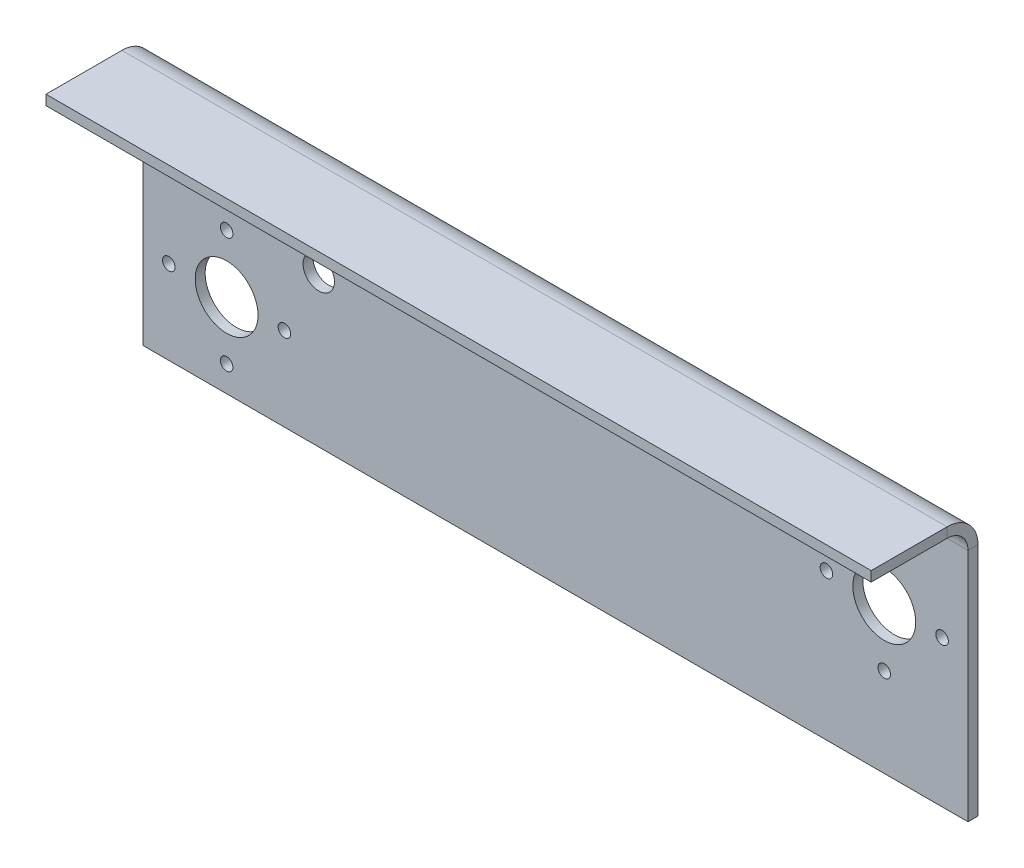
ISO-10303-21;
HEADER;
FILE_DESCRIPTION(('STEP AP214'),'2;1');
FILE_NAME('part.step','',(''),(''),'','','');
FILE_SCHEMA(('AUTOMOTIVE_DESIGN { 1 0 10303 214 1 1 1 1 }'));
ENDSEC;
DATA;
#1=APPLICATION_CONTEXT('core data for automotive mechanical design processes');
#2=APPLICATION_PROTOCOL_DEFINITION('international standard','automotive_design',2000,#1);
#3=PRODUCT_CONTEXT('',#1,'mechanical');
#4=PRODUCT('Part','Part','',(#3));
#5=PRODUCT_RELATED_PRODUCT_CATEGORY('part','',(#4));
#6=PRODUCT_DEFINITION_FORMATION('','',#4);
#7=PRODUCT_DEFINITION_CONTEXT('part definition',#1,'design');
#8=PRODUCT_DEFINITION('design','',#6,#7);
#9=PRODUCT_DEFINITION_SHAPE('','',#8);
#10=(LENGTH_UNIT() NAMED_UNIT(*) SI_UNIT(.MILLI.,.METRE.));
#11=(NAMED_UNIT(*) PLANE_ANGLE_UNIT() SI_UNIT($,.RADIAN.));
#12=(NAMED_UNIT(*) SI_UNIT($,.STERADIAN.) SOLID_ANGLE_UNIT());
#13=UNCERTAINTY_MEASURE_WITH_UNIT(LENGTH_MEASURE(1.E-05),#10,'distance_accuracy_value','');
#14=(GEOMETRIC_REPRESENTATION_CONTEXT(3) GLOBAL_UNCERTAINTY_ASSIGNED_CONTEXT((#13)) GLOBAL_UNIT_ASSIGNED_CONTEXT((#10,
#11,#12)) REPRESENTATION_CONTEXT('',''));
#15=CARTESIAN_POINT('',(0.,0.,0.));
#16=DIRECTION('',(0.,0.,1.));
#17=DIRECTION('',(1.,0.,0.));
#18=AXIS2_PLACEMENT_3D('',#15,#16,#17);
#19=CARTESIAN_POINT('',(-40.,87.,4.7625));
#20=DIRECTION('',(-1.,0.,0.));
#21=DIRECTION('',(0.,-1.,0.));
#22=AXIS2_PLACEMENT_3D('',#19,#20,#21);
#23=PLANE('',#22);
#24=DIRECTION('',(0.,-1.,0.));
#25=VECTOR('',#24,1.);
#26=CARTESIAN_POINT('',(-40.,87.,4.7625));
#27=LINE('',#26,#25);
#28=CARTESIAN_POINT('',(-40.,72.2375,4.7625));
#29=VERTEX_POINT('',#28);
#30=CARTESIAN_POINT('',(-40.,-40.,4.7625));
#31=VERTEX_POINT('',#30);
#32=EDGE_CURVE('E265',#29,#31,#27,.T.);
#33=ORIENTED_EDGE('',*,*,#32,.F.);
#34=DIRECTION('',(0.,0.,-1.));
#35=VECTOR('',#34,1.);
#36=CARTESIAN_POINT('',(-40.,72.2375,4.7625));
#37=LINE('',#36,#35);
#38=CARTESIAN_POINT('',(-40.,72.2375,0.));
#39=VERTEX_POINT('',#38);
#40=EDGE_CURVE('E221',#29,#39,#37,.T.);
#41=ORIENTED_EDGE('',*,*,#40,.T.);
#42=DIRECTION('',(0.,1.,0.));
#43=VECTOR('',#42,1.);
#44=CARTESIAN_POINT('',(-40.,0.,0.));
#45=LINE('',#44,#43);
#46=CARTESIAN_POINT('',(-40.,-40.,0.));
#47=VERTEX_POINT('',#46);
#48=EDGE_CURVE('E302',#39,#47,#45,.F.);
#49=ORIENTED_EDGE('',*,*,#48,.T.);
#50=DIRECTION('',(0.,0.,1.));
#51=VECTOR('',#50,1.);
#52=CARTESIAN_POINT('',(-40.,-40.,4.7625));
#53=LINE('',#52,#51);
#54=EDGE_CURVE('E65',#47,#31,#53,.T.);
#55=ORIENTED_EDGE('',*,*,#54,.T.);
#56=EDGE_LOOP('',(#33,#41,#49,#55));
#57=FACE_BOUND('',#56,.T.);
#58=ADVANCED_FACE('F61',(#57),#23,.T.);
#59=CARTESIAN_POINT('',(0.,0.,4.7625));
#60=DIRECTION('',(0.,0.,1.));
#61=DIRECTION('',(1.,0.,0.));
#62=AXIS2_PLACEMENT_3D('',#59,#60,#61);
#63=PLANE('',#62);
#64=CARTESIAN_POINT('',(276.,64.,4.7625));
#65=DIRECTION('',(0.,0.,1.));
#66=DIRECTION('',(1.,0.,0.));
#67=AXIS2_PLACEMENT_3D('',#64,#65,#66);
#68=CIRCLE('',#67,7.99999999999999);
#69=CARTESIAN_POINT('',(284.,64.,4.7625));
#70=VERTEX_POINT('',#69);
#71=EDGE_CURVE('E652',#70,#70,#68,.T.);
#72=ORIENTED_EDGE('',*,*,#71,.F.);
#73=EDGE_LOOP('',(#72));
#74=FACE_BOUND('',#73,.T.);
#75=CARTESIAN_POINT('',(44.,32.,4.7625));
#76=DIRECTION('',(0.,0.,1.));
#77=DIRECTION('',(1.,0.,0.));
#78=AXIS2_PLACEMENT_3D('',#75,#76,#77);
#79=CIRCLE('',#78,7.50000000000001);
#80=CARTESIAN_POINT('',(51.5,32.,4.7625));
#81=VERTEX_POINT('',#80);
#82=EDGE_CURVE('E662',#81,#81,#79,.T.);
#83=ORIENTED_EDGE('',*,*,#82,.F.);
#84=EDGE_LOOP('',(#83));
#85=FACE_BOUND('',#84,.T.);
#86=CARTESIAN_POINT('',(7.00000000000001,64.,4.7625));
#87=DIRECTION('',(0.,0.,1.));
#88=DIRECTION('',(1.,0.,0.));
#89=AXIS2_PLACEMENT_3D('',#86,#87,#88);
#90=CIRCLE('',#89,4.99999999999999);
#91=CARTESIAN_POINT('',(7.00000000000001,69.,4.7625));
#92=VERTEX_POINT('',#91);
#93=CARTESIAN_POINT('',(7.00000000000001,59.,4.7625));
#94=VERTEX_POINT('',#93);
#95=EDGE_CURVE('E182',#92,#94,#90,.T.);
#96=ORIENTED_EDGE('',*,*,#95,.F.);
#97=DIRECTION('',(-1.,0.,0.));
#98=VECTOR('',#97,1.);
#99=CARTESIAN_POINT('',(0.,69.,4.7625));
#100=LINE('',#99,#98);
#101=CARTESIAN_POINT('',(161.,69.,4.7625));
#102=VERTEX_POINT('',#101);
#103=EDGE_CURVE('E175',#102,#92,#100,.T.);
#104=ORIENTED_EDGE('',*,*,#103,.F.);
#105=CARTESIAN_POINT('',(161.,64.,4.7625));
#106=DIRECTION('',(0.,0.,1.));
#107=DIRECTION('',(1.,0.,0.));
#108=AXIS2_PLACEMENT_3D('',#105,#106,#107);
#109=CIRCLE('',#108,5.);
#110=CARTESIAN_POINT('',(161.,59.,4.7625));
#111=VERTEX_POINT('',#110);
#112=EDGE_CURVE('E155',#111,#102,#109,.T.);
#113=ORIENTED_EDGE('',*,*,#112,.F.);
#114=DIRECTION('',(1.,0.,0.));
#115=VECTOR('',#114,1.);
#116=CARTESIAN_POINT('',(0.,59.,4.7625));
#117=LINE('',#116,#115);
#118=EDGE_CURVE('E180',#94,#111,#117,.T.);
#119=ORIENTED_EDGE('',*,*,#118,.F.);
#120=EDGE_LOOP('',(#96,#104,#113,#119));
#121=FACE_BOUND('',#120,.T.);
#122=CARTESIAN_POINT('',(286.4,29.9999999999999,4.7625));
#123=DIRECTION('',(0.,0.,1.));
#124=DIRECTION('',(0.,1.,0.));
#125=AXIS2_PLACEMENT_3D('',#122,#123,#124);
#126=CIRCLE('',#125,2.99999999999999);
#127=CARTESIAN_POINT('',(286.4,32.9999999999999,4.7625));
#128=VERTEX_POINT('',#127);
#129=EDGE_CURVE('E237',#128,#128,#126,.T.);
#130=ORIENTED_EDGE('',*,*,#129,.F.);
#131=EDGE_LOOP('',(#130));
#132=FACE_BOUND('',#131,.T.);
#133=CARTESIAN_POINT('',(314.,2.4,4.7625));
#134=DIRECTION('',(0.,0.,1.));
#135=DIRECTION('',(-1.,0.,0.));
#136=AXIS2_PLACEMENT_3D('',#133,#134,#135);
#137=CIRCLE('',#136,2.99999999999999);
#138=CARTESIAN_POINT('',(311.,2.4,4.7625));
#139=VERTEX_POINT('',#138);
#140=EDGE_CURVE('E240',#139,#139,#137,.T.);
#141=ORIENTED_EDGE('',*,*,#140,.F.);
#142=EDGE_LOOP('',(#141));
#143=FACE_BOUND('',#142,.T.);
#144=CARTESIAN_POINT('',(341.6,30.0000000000002,4.7625));
#145=DIRECTION('',(0.,0.,1.));
#146=DIRECTION('',(0.,-1.,0.));
#147=AXIS2_PLACEMENT_3D('',#144,#145,#146);
#148=CIRCLE('',#147,2.99999999999999);
#149=CARTESIAN_POINT('',(341.6,27.0000000000003,4.7625));
#150=VERTEX_POINT('',#149);
#151=EDGE_CURVE('E244',#150,#150,#148,.T.);
#152=ORIENTED_EDGE('',*,*,#151,.F.);
#153=EDGE_LOOP('',(#152));
#154=FACE_BOUND('',#153,.T.);
#155=CARTESIAN_POINT('',(314.,57.6,4.7625));
#156=DIRECTION('',(0.,0.,1.));
#157=DIRECTION('',(1.,0.,0.));
#158=AXIS2_PLACEMENT_3D('',#155,#156,#157);
#159=CIRCLE('',#158,2.99999999999999);
#160=CARTESIAN_POINT('',(317.,57.6,4.7625));
#161=VERTEX_POINT('',#160);
#162=EDGE_CURVE('E247',#161,#161,#159,.T.);
#163=ORIENTED_EDGE('',*,*,#162,.F.);
#164=EDGE_LOOP('',(#163));
#165=FACE_BOUND('',#164,.T.);
#166=CARTESIAN_POINT('',(-27.5975865890763,-3.92185310250527E-12,4.7625));
#167=DIRECTION('',(0.,0.,1.));
#168=DIRECTION('',(1.,0.,0.));
#169=AXIS2_PLACEMENT_3D('',#166,#167,#168);
#170=CIRCLE('',#169,3.00000000000517);
#171=CARTESIAN_POINT('',(-24.5975865890712,-3.92185310250527E-12,4.7625));
#172=VERTEX_POINT('',#171);
#173=EDGE_CURVE('E250',#172,#172,#170,.T.);
#174=ORIENTED_EDGE('',*,*,#173,.F.);
#175=EDGE_LOOP('',(#174));
#176=FACE_BOUND('',#175,.T.);
#177=CARTESIAN_POINT('',(7.83694674579444E-12,-27.5975865890803,4.7625));
#178=DIRECTION('',(0.,0.,1.));
#179=DIRECTION('',(1.,0.,0.));
#180=AXIS2_PLACEMENT_3D('',#177,#178,#179);
#181=CIRCLE('',#180,3.00000000000768);
#182=CARTESIAN_POINT('',(3.00000000001551,-27.5975865890803,4.7625));
#183=VERTEX_POINT('',#182);
#184=EDGE_CURVE('E253',#183,#183,#181,.T.);
#185=ORIENTED_EDGE('',*,*,#184,.F.);
#186=EDGE_LOOP('',(#185));
#187=FACE_BOUND('',#186,.T.);
#188=CARTESIAN_POINT('',(27.5975865890842,3.91847337289722E-12,4.7625));
#189=DIRECTION('',(0.,0.,1.));
#190=DIRECTION('',(1.,0.,0.));
#191=AXIS2_PLACEMENT_3D('',#188,#189,#190);
#192=CIRCLE('',#191,3.00000000000269);
#193=CARTESIAN_POINT('',(30.5975865890869,3.91847337289722E-12,4.7625));
#194=VERTEX_POINT('',#193);
#195=EDGE_CURVE('E256',#194,#194,#192,.T.);
#196=ORIENTED_EDGE('',*,*,#195,.F.);
#197=EDGE_LOOP('',(#196));
#198=FACE_BOUND('',#197,.T.);
#199=CARTESIAN_POINT('',(0.,27.5975865890803,4.7625));
#200=DIRECTION('',(0.,0.,1.));
#201=DIRECTION('',(1.,0.,0.));
#202=AXIS2_PLACEMENT_3D('',#199,#200,#201);
#203=CIRCLE('',#202,3.);
#204=CARTESIAN_POINT('',(3.,27.5975865890803,4.7625));
#205=VERTEX_POINT('',#204);
#206=EDGE_CURVE('E259',#205,#205,#203,.T.);
#207=ORIENTED_EDGE('',*,*,#206,.F.);
#208=EDGE_LOOP('',(#207));
#209=FACE_BOUND('',#208,.T.);
#210=CARTESIAN_POINT('',(0.,0.,4.7625));
#211=DIRECTION('',(0.,0.,1.));
#212=DIRECTION('',(1.,0.,0.));
#213=AXIS2_PLACEMENT_3D('',#210,#211,#212);
#214=CIRCLE('',#213,15.);
#215=CARTESIAN_POINT('',(15.,0.,4.7625));
#216=VERTEX_POINT('',#215);
#217=EDGE_CURVE('E262',#216,#216,#214,.T.);
#218=ORIENTED_EDGE('',*,*,#217,.F.);
#219=EDGE_LOOP('',(#218));
#220=FACE_BOUND('',#219,.T.);
#221=CARTESIAN_POINT('',(314.,30.,4.7625));
#222=DIRECTION('',(0.,0.,1.));
#223=DIRECTION('',(1.,0.,0.));
#224=AXIS2_PLACEMENT_3D('',#221,#222,#223);
#225=CIRCLE('',#224,15.);
#226=CARTESIAN_POINT('',(329.,30.,4.7625));
#227=VERTEX_POINT('',#226);
#228=EDGE_CURVE('E273',#227,#227,#225,.T.);
#229=ORIENTED_EDGE('',*,*,#228,.F.);
#230=EDGE_LOOP('',(#229));
#231=FACE_BOUND('',#230,.T.);
#232=DIRECTION('',(0.,1.,0.));
#233=VECTOR('',#232,1.);
#234=CARTESIAN_POINT('',(354.,87.,4.7625));
#235=LINE('',#234,#233);
#236=CARTESIAN_POINT('',(354.,-40.,4.7625));
#237=VERTEX_POINT('',#236);
#238=CARTESIAN_POINT('',(354.,72.2375,4.7625));
#239=VERTEX_POINT('',#238);
#240=EDGE_CURVE('E270',#237,#239,#235,.T.);
#241=ORIENTED_EDGE('',*,*,#240,.T.);
#242=DIRECTION('',(-1.,0.,0.));
#243=VECTOR('',#242,1.);
#244=CARTESIAN_POINT('',(-40.,72.2375,4.7625));
#245=LINE('',#244,#243);
#246=EDGE_CURVE('E227',#29,#239,#245,.F.);
#247=ORIENTED_EDGE('',*,*,#246,.F.);
#248=ORIENTED_EDGE('',*,*,#32,.T.);
#249=DIRECTION('',(1.,0.,0.));
#250=VECTOR('',#249,1.);
#251=CARTESIAN_POINT('',(-40.,-40.,4.7625));
#252=LINE('',#251,#250);
#253=EDGE_CURVE('E267',#31,#237,#252,.T.);
#254=ORIENTED_EDGE('',*,*,#253,.T.);
#255=EDGE_LOOP('',(#241,#247,#248,#254));
#256=FACE_BOUND('',#255,.T.);
#257=ADVANCED_FACE('F328',(#74,#85,#121,#132,#143,#154,#165,#176,#187,#198,#209,#220,#231,#256),
#63,.T.);
#258=CARTESIAN_POINT('',(0.,0.,0.));
#259=DIRECTION('',(0.,0.,1.));
#260=DIRECTION('',(1.,0.,0.));
#261=AXIS2_PLACEMENT_3D('',#258,#259,#260);
#262=PLANE('',#261);
#263=CARTESIAN_POINT('',(276.,64.,0.));
#264=DIRECTION('',(0.,0.,-1.));
#265=DIRECTION('',(-1.,0.,0.));
#266=AXIS2_PLACEMENT_3D('',#263,#264,#265);
#267=CIRCLE('',#266,7.99999999999999);
#268=CARTESIAN_POINT('',(268.,64.,0.));
#269=VERTEX_POINT('',#268);
#270=EDGE_CURVE('E655',#269,#269,#267,.T.);
#271=ORIENTED_EDGE('',*,*,#270,.F.);
#272=EDGE_LOOP('',(#271));
#273=FACE_BOUND('',#272,.T.);
#274=CARTESIAN_POINT('',(44.,32.,0.));
#275=DIRECTION('',(0.,0.,-1.));
#276=DIRECTION('',(-1.,0.,0.));
#277=AXIS2_PLACEMENT_3D('',#274,#275,#276);
#278=CIRCLE('',#277,7.50000000000001);
#279=CARTESIAN_POINT('',(36.5,32.,0.));
#280=VERTEX_POINT('',#279);
#281=EDGE_CURVE('E657',#280,#280,#278,.T.);
#282=ORIENTED_EDGE('',*,*,#281,.F.);
#283=EDGE_LOOP('',(#282));
#284=FACE_BOUND('',#283,.T.);
#285=DIRECTION('',(1.,0.,0.));
#286=VECTOR('',#285,1.);
#287=CARTESIAN_POINT('',(7.00000000000001,69.,0.));
#288=LINE('',#287,#286);
#289=CARTESIAN_POINT('',(7.00000000000001,69.,0.));
#290=VERTEX_POINT('',#289);
#291=CARTESIAN_POINT('',(161.,69.,0.));
#292=VERTEX_POINT('',#291);
#293=EDGE_CURVE('E161',#290,#292,#288,.T.);
#294=ORIENTED_EDGE('',*,*,#293,.F.);
#295=CARTESIAN_POINT('',(7.00000000000001,64.,0.));
#296=DIRECTION('',(0.,0.,-1.));
#297=DIRECTION('',(-1.,0.,0.));
#298=AXIS2_PLACEMENT_3D('',#295,#296,#297);
#299=CIRCLE('',#298,4.99999999999999);
#300=CARTESIAN_POINT('',(7.00000000000001,59.,0.));
#301=VERTEX_POINT('',#300);
#302=EDGE_CURVE('E84',#301,#290,#299,.T.);
#303=ORIENTED_EDGE('',*,*,#302,.F.);
#304=DIRECTION('',(-1.,0.,0.));
#305=VECTOR('',#304,1.);
#306=CARTESIAN_POINT('',(7.00000000000001,59.,0.));
#307=LINE('',#306,#305);
#308=CARTESIAN_POINT('',(161.,59.,0.));
#309=VERTEX_POINT('',#308);
#310=EDGE_CURVE('E168',#309,#301,#307,.T.);
#311=ORIENTED_EDGE('',*,*,#310,.F.);
#312=CARTESIAN_POINT('',(161.,64.,0.));
#313=DIRECTION('',(0.,0.,-1.));
#314=DIRECTION('',(-1.,0.,0.));
#315=AXIS2_PLACEMENT_3D('',#312,#313,#314);
#316=CIRCLE('',#315,5.);
#317=EDGE_CURVE('E152',#292,#309,#316,.T.);
#318=ORIENTED_EDGE('',*,*,#317,.F.);
#319=EDGE_LOOP('',(#294,#303,#311,#318));
#320=FACE_BOUND('',#319,.T.);
#321=CARTESIAN_POINT('',(314.,30.,0.));
#322=DIRECTION('',(0.,0.,1.));
#323=DIRECTION('',(1.,0.,0.));
#324=AXIS2_PLACEMENT_3D('',#321,#322,#323);
#325=CIRCLE('',#324,15.);
#326=CARTESIAN_POINT('',(329.,30.,0.));
#327=VERTEX_POINT('',#326);
#328=EDGE_CURVE('E241',#327,#327,#325,.T.);
#329=ORIENTED_EDGE('',*,*,#328,.T.);
#330=EDGE_LOOP('',(#329));
#331=FACE_BOUND('',#330,.T.);
#332=CARTESIAN_POINT('',(0.,0.,0.));
#333=DIRECTION('',(0.,0.,1.));
#334=DIRECTION('',(1.,0.,0.));
#335=AXIS2_PLACEMENT_3D('',#332,#333,#334);
#336=CIRCLE('',#335,15.);
#337=CARTESIAN_POINT('',(15.,0.,0.));
#338=VERTEX_POINT('',#337);
#339=EDGE_CURVE('E299',#338,#338,#336,.T.);
#340=ORIENTED_EDGE('',*,*,#339,.T.);
#341=EDGE_LOOP('',(#340));
#342=FACE_BOUND('',#341,.T.);
#343=CARTESIAN_POINT('',(0.,27.5975865890803,0.));
#344=DIRECTION('',(0.,0.,1.));
#345=DIRECTION('',(1.,0.,0.));
#346=AXIS2_PLACEMENT_3D('',#343,#344,#345);
#347=CIRCLE('',#346,3.);
#348=CARTESIAN_POINT('',(3.,27.5975865890803,0.));
#349=VERTEX_POINT('',#348);
#350=EDGE_CURVE('E296',#349,#349,#347,.T.);
#351=ORIENTED_EDGE('',*,*,#350,.T.);
#352=EDGE_LOOP('',(#351));
#353=FACE_BOUND('',#352,.T.);
#354=CARTESIAN_POINT('',(27.5975865890842,3.91847337289722E-12,0.));
#355=DIRECTION('',(0.,0.,1.));
#356=DIRECTION('',(1.,0.,0.));
#357=AXIS2_PLACEMENT_3D('',#354,#355,#356);
#358=CIRCLE('',#357,3.00000000000269);
#359=CARTESIAN_POINT('',(30.5975865890869,3.91847337289722E-12,0.));
#360=VERTEX_POINT('',#359);
#361=EDGE_CURVE('E293',#360,#360,#358,.T.);
#362=ORIENTED_EDGE('',*,*,#361,.T.);
#363=EDGE_LOOP('',(#362));
#364=FACE_BOUND('',#363,.T.);
#365=CARTESIAN_POINT('',(7.83694674579444E-12,-27.5975865890803,0.));
#366=DIRECTION('',(0.,0.,1.));
#367=DIRECTION('',(1.,0.,0.));
#368=AXIS2_PLACEMENT_3D('',#365,#366,#367);
#369=CIRCLE('',#368,3.00000000000768);
#370=CARTESIAN_POINT('',(3.00000000001551,-27.5975865890803,0.));
#371=VERTEX_POINT('',#370);
#372=EDGE_CURVE('E290',#371,#371,#369,.T.);
#373=ORIENTED_EDGE('',*,*,#372,.T.);
#374=EDGE_LOOP('',(#373));
#375=FACE_BOUND('',#374,.T.);
#376=CARTESIAN_POINT('',(-27.5975865890763,-3.92185310250527E-12,0.));
#377=DIRECTION('',(0.,0.,1.));
#378=DIRECTION('',(1.,0.,0.));
#379=AXIS2_PLACEMENT_3D('',#376,#377,#378);
#380=CIRCLE('',#379,3.00000000000517);
#381=CARTESIAN_POINT('',(-24.5975865890712,-3.92185310250527E-12,0.));
#382=VERTEX_POINT('',#381);
#383=EDGE_CURVE('E287',#382,#382,#380,.T.);
#384=ORIENTED_EDGE('',*,*,#383,.T.);
#385=EDGE_LOOP('',(#384));
#386=FACE_BOUND('',#385,.T.);
#387=CARTESIAN_POINT('',(314.,57.6,0.));
#388=DIRECTION('',(0.,0.,1.));
#389=DIRECTION('',(1.,0.,0.));
#390=AXIS2_PLACEMENT_3D('',#387,#388,#389);
#391=CIRCLE('',#390,2.99999999999999);
#392=CARTESIAN_POINT('',(317.,57.6,0.));
#393=VERTEX_POINT('',#392);
#394=EDGE_CURVE('E284',#393,#393,#391,.T.);
#395=ORIENTED_EDGE('',*,*,#394,.T.);
#396=EDGE_LOOP('',(#395));
#397=FACE_BOUND('',#396,.T.);
#398=CARTESIAN_POINT('',(341.6,30.0000000000002,0.));
#399=DIRECTION('',(0.,0.,1.));
#400=DIRECTION('',(1.,0.,0.));
#401=AXIS2_PLACEMENT_3D('',#398,#399,#400);
#402=CIRCLE('',#401,2.99999999999999);
#403=CARTESIAN_POINT('',(344.6,30.0000000000002,0.));
#404=VERTEX_POINT('',#403);
#405=EDGE_CURVE('E281',#404,#404,#402,.T.);
#406=ORIENTED_EDGE('',*,*,#405,.T.);
#407=EDGE_LOOP('',(#406));
#408=FACE_BOUND('',#407,.T.);
#409=CARTESIAN_POINT('',(314.,2.4,0.));
#410=DIRECTION('',(0.,0.,1.));
#411=DIRECTION('',(1.,0.,0.));
#412=AXIS2_PLACEMENT_3D('',#409,#410,#411);
#413=CIRCLE('',#412,2.99999999999999);
#414=CARTESIAN_POINT('',(317.,2.4,0.));
#415=VERTEX_POINT('',#414);
#416=EDGE_CURVE('E278',#415,#415,#413,.T.);
#417=ORIENTED_EDGE('',*,*,#416,.T.);
#418=EDGE_LOOP('',(#417));
#419=FACE_BOUND('',#418,.T.);
#420=CARTESIAN_POINT('',(286.4,29.9999999999999,0.));
#421=DIRECTION('',(0.,0.,1.));
#422=DIRECTION('',(1.,0.,0.));
#423=AXIS2_PLACEMENT_3D('',#420,#421,#422);
#424=CIRCLE('',#423,2.99999999999999);
#425=CARTESIAN_POINT('',(289.4,29.9999999999999,0.));
#426=VERTEX_POINT('',#425);
#427=EDGE_CURVE('E235',#426,#426,#424,.T.);
#428=ORIENTED_EDGE('',*,*,#427,.T.);
#429=EDGE_LOOP('',(#428));
#430=FACE_BOUND('',#429,.T.);
#431=DIRECTION('',(-1.,0.,0.));
#432=VECTOR('',#431,1.);
#433=CARTESIAN_POINT('',(-40.,72.2375,0.));
#434=LINE('',#433,#432);
#435=CARTESIAN_POINT('',(354.,72.2375,0.));
#436=VERTEX_POINT('',#435);
#437=EDGE_CURVE('E215',#39,#436,#434,.F.);
#438=ORIENTED_EDGE('',*,*,#437,.T.);
#439=DIRECTION('',(0.,1.,0.));
#440=VECTOR('',#439,1.);
#441=CARTESIAN_POINT('',(354.,0.,0.));
#442=LINE('',#441,#440);
#443=CARTESIAN_POINT('',(354.,-40.,0.));
#444=VERTEX_POINT('',#443);
#445=EDGE_CURVE('E305',#444,#436,#442,.T.);
#446=ORIENTED_EDGE('',*,*,#445,.F.);
#447=DIRECTION('',(1.,0.,0.));
#448=VECTOR('',#447,1.);
#449=CARTESIAN_POINT('',(0.,-40.,0.));
#450=LINE('',#449,#448);
#451=EDGE_CURVE('E304',#47,#444,#450,.T.);
#452=ORIENTED_EDGE('',*,*,#451,.F.);
#453=ORIENTED_EDGE('',*,*,#48,.F.);
#454=EDGE_LOOP('',(#438,#446,#452,#453));
#455=FACE_BOUND('',#454,.T.);
#456=ADVANCED_FACE('F165',(#273,#284,#320,#331,#342,#353,#364,#375,#386,#397,#408,#419,#430,
#455),#262,.F.);
#457=CARTESIAN_POINT('',(354.,87.,4.7625));
#458=DIRECTION('',(1.,0.,0.));
#459=DIRECTION('',(0.,1.,0.));
#460=AXIS2_PLACEMENT_3D('',#457,#458,#459);
#461=PLANE('',#460);
#462=DIRECTION('',(0.,0.,-1.));
#463=VECTOR('',#462,1.);
#464=CARTESIAN_POINT('',(354.,72.2375,4.7625));
#465=LINE('',#464,#463);
#466=EDGE_CURVE('E232',#239,#436,#465,.T.);
#467=ORIENTED_EDGE('',*,*,#466,.F.);
#468=ORIENTED_EDGE('',*,*,#240,.F.);
#469=DIRECTION('',(0.,0.,1.));
#470=VECTOR('',#469,1.);
#471=CARTESIAN_POINT('',(354.,-40.,4.7625));
#472=LINE('',#471,#470);
#473=EDGE_CURVE('E13',#444,#237,#472,.T.);
#474=ORIENTED_EDGE('',*,*,#473,.F.);
#475=ORIENTED_EDGE('',*,*,#445,.T.);
#476=EDGE_LOOP('',(#467,#468,#474,#475));
#477=FACE_BOUND('',#476,.T.);
#478=ADVANCED_FACE('F340',(#477),#461,.T.);
#479=CARTESIAN_POINT('',(286.4,29.9999999999999,4.7625));
#480=DIRECTION('',(0.,0.,1.));
#481=DIRECTION('',(1.,0.,0.));
#482=AXIS2_PLACEMENT_3D('',#479,#480,#481);
#483=CYLINDRICAL_SURFACE('',#482,2.99999999999999);
#484=ORIENTED_EDGE('',*,*,#129,.T.);
#485=EDGE_LOOP('',(#484));
#486=FACE_BOUND('',#485,.T.);
#487=ORIENTED_EDGE('',*,*,#427,.F.);
#488=EDGE_LOOP('',(#487));
#489=FACE_BOUND('',#488,.T.);
#490=ADVANCED_FACE('F342',(#486,#489),#483,.F.);
#491=CARTESIAN_POINT('',(314.,2.4,4.7625));
#492=DIRECTION('',(0.,0.,1.));
#493=DIRECTION('',(1.,0.,0.));
#494=AXIS2_PLACEMENT_3D('',#491,#492,#493);
#495=CYLINDRICAL_SURFACE('',#494,2.99999999999999);
#496=ORIENTED_EDGE('',*,*,#140,.T.);
#497=EDGE_LOOP('',(#496));
#498=FACE_BOUND('',#497,.T.);
#499=ORIENTED_EDGE('',*,*,#416,.F.);
#500=EDGE_LOOP('',(#499));
#501=FACE_BOUND('',#500,.T.);
#502=ADVANCED_FACE('F348',(#498,#501),#495,.F.);
#503=CARTESIAN_POINT('',(341.6,30.0000000000002,4.7625));
#504=DIRECTION('',(0.,0.,1.));
#505=DIRECTION('',(1.,0.,0.));
#506=AXIS2_PLACEMENT_3D('',#503,#504,#505);
#507=CYLINDRICAL_SURFACE('',#506,2.99999999999999);
#508=ORIENTED_EDGE('',*,*,#151,.T.);
#509=EDGE_LOOP('',(#508));
#510=FACE_BOUND('',#509,.T.);
#511=ORIENTED_EDGE('',*,*,#405,.F.);
#512=EDGE_LOOP('',(#511));
#513=FACE_BOUND('',#512,.T.);
#514=ADVANCED_FACE('F406',(#510,#513),#507,.F.);
#515=CARTESIAN_POINT('',(314.,57.6,4.7625));
#516=DIRECTION('',(0.,0.,1.));
#517=DIRECTION('',(1.,0.,0.));
#518=AXIS2_PLACEMENT_3D('',#515,#516,#517);
#519=CYLINDRICAL_SURFACE('',#518,2.99999999999999);
#520=ORIENTED_EDGE('',*,*,#162,.T.);
#521=EDGE_LOOP('',(#520));
#522=FACE_BOUND('',#521,.T.);
#523=ORIENTED_EDGE('',*,*,#394,.F.);
#524=EDGE_LOOP('',(#523));
#525=FACE_BOUND('',#524,.T.);
#526=ADVANCED_FACE('F410',(#522,#525),#519,.F.);
#527=CARTESIAN_POINT('',(-27.5975865890763,-3.92185310250527E-12,4.7625));
#528=DIRECTION('',(0.,0.,1.));
#529=DIRECTION('',(1.,0.,0.));
#530=AXIS2_PLACEMENT_3D('',#527,#528,#529);
#531=CYLINDRICAL_SURFACE('',#530,3.00000000000517);
#532=ORIENTED_EDGE('',*,*,#173,.T.);
#533=EDGE_LOOP('',(#532));
#534=FACE_BOUND('',#533,.T.);
#535=ORIENTED_EDGE('',*,*,#383,.F.);
#536=EDGE_LOOP('',(#535));
#537=FACE_BOUND('',#536,.T.);
#538=ADVANCED_FACE('F414',(#534,#537),#531,.F.);
#539=CARTESIAN_POINT('',(7.83694674579444E-12,-27.5975865890803,4.7625));
#540=DIRECTION('',(0.,0.,1.));
#541=DIRECTION('',(1.,0.,0.));
#542=AXIS2_PLACEMENT_3D('',#539,#540,#541);
#543=CYLINDRICAL_SURFACE('',#542,3.00000000000768);
#544=ORIENTED_EDGE('',*,*,#184,.T.);
#545=EDGE_LOOP('',(#544));
#546=FACE_BOUND('',#545,.T.);
#547=ORIENTED_EDGE('',*,*,#372,.F.);
#548=EDGE_LOOP('',(#547));
#549=FACE_BOUND('',#548,.T.);
#550=ADVANCED_FACE('F418',(#546,#549),#543,.F.);
#551=CARTESIAN_POINT('',(27.5975865890842,3.91847337289722E-12,4.7625));
#552=DIRECTION('',(0.,0.,1.));
#553=DIRECTION('',(1.,0.,0.));
#554=AXIS2_PLACEMENT_3D('',#551,#552,#553);
#555=CYLINDRICAL_SURFACE('',#554,3.00000000000269);
#556=ORIENTED_EDGE('',*,*,#195,.T.);
#557=EDGE_LOOP('',(#556));
#558=FACE_BOUND('',#557,.T.);
#559=ORIENTED_EDGE('',*,*,#361,.F.);
#560=EDGE_LOOP('',(#559));
#561=FACE_BOUND('',#560,.T.);
#562=ADVANCED_FACE('F422',(#558,#561),#555,.F.);
#563=CARTESIAN_POINT('',(0.,27.5975865890803,4.7625));
#564=DIRECTION('',(0.,0.,1.));
#565=DIRECTION('',(1.,0.,0.));
#566=AXIS2_PLACEMENT_3D('',#563,#564,#565);
#567=CYLINDRICAL_SURFACE('',#566,3.);
#568=ORIENTED_EDGE('',*,*,#206,.T.);
#569=EDGE_LOOP('',(#568));
#570=FACE_BOUND('',#569,.T.);
#571=ORIENTED_EDGE('',*,*,#350,.F.);
#572=EDGE_LOOP('',(#571));
#573=FACE_BOUND('',#572,.T.);
#574=ADVANCED_FACE('F425',(#570,#573),#567,.F.);
#575=CARTESIAN_POINT('',(0.,0.,4.7625));
#576=DIRECTION('',(0.,0.,1.));
#577=DIRECTION('',(1.,0.,0.));
#578=AXIS2_PLACEMENT_3D('',#575,#576,#577);
#579=CYLINDRICAL_SURFACE('',#578,15.);
#580=ORIENTED_EDGE('',*,*,#217,.T.);
#581=EDGE_LOOP('',(#580));
#582=FACE_BOUND('',#581,.T.);
#583=ORIENTED_EDGE('',*,*,#339,.F.);
#584=EDGE_LOOP('',(#583));
#585=FACE_BOUND('',#584,.T.);
#586=ADVANCED_FACE('F325',(#582,#585),#579,.F.);
#587=CARTESIAN_POINT('',(-40.,-40.,4.7625));
#588=DIRECTION('',(0.,-1.,0.));
#589=DIRECTION('',(1.,0.,0.));
#590=AXIS2_PLACEMENT_3D('',#587,#588,#589);
#591=PLANE('',#590);
#592=ORIENTED_EDGE('',*,*,#451,.T.);
#593=ORIENTED_EDGE('',*,*,#473,.T.);
#594=ORIENTED_EDGE('',*,*,#253,.F.);
#595=ORIENTED_EDGE('',*,*,#54,.F.);
#596=EDGE_LOOP('',(#592,#593,#594,#595));
#597=FACE_BOUND('',#596,.T.);
#598=ADVANCED_FACE('F316',(#597),#591,.T.);
#599=CARTESIAN_POINT('',(314.,30.,4.7625));
#600=DIRECTION('',(0.,0.,1.));
#601=DIRECTION('',(1.,0.,0.));
#602=AXIS2_PLACEMENT_3D('',#599,#600,#601);
#603=CYLINDRICAL_SURFACE('',#602,15.);
#604=ORIENTED_EDGE('',*,*,#228,.T.);
#605=EDGE_LOOP('',(#604));
#606=FACE_BOUND('',#605,.T.);
#607=ORIENTED_EDGE('',*,*,#328,.F.);
#608=EDGE_LOOP('',(#607));
#609=FACE_BOUND('',#608,.T.);
#610=ADVANCED_FACE('F63',(#606,#609),#603,.F.);
#611=CARTESIAN_POINT('',(354.,72.2375,14.7625));
#612=DIRECTION('',(1.,0.,0.));
#613=DIRECTION('',(0.,0.,-1.));
#614=AXIS2_PLACEMENT_3D('',#611,#612,#613);
#615=PLANE('',#614);
#616=DIRECTION('',(0.,-1.,0.));
#617=VECTOR('',#616,1.);
#618=CARTESIAN_POINT('',(354.,87.,14.7625));
#619=LINE('',#618,#617);
#620=CARTESIAN_POINT('',(354.,82.2375,14.7625));
#621=VERTEX_POINT('',#620);
#622=CARTESIAN_POINT('',(354.,87.,14.7624999999999));
#623=VERTEX_POINT('',#622);
#624=EDGE_CURVE('E184',#621,#623,#619,.F.);
#625=ORIENTED_EDGE('',*,*,#624,.F.);
#626=CARTESIAN_POINT('',(354.,72.2375,14.7625));
#627=DIRECTION('',(-1.,0.,0.));
#628=DIRECTION('',(0.,0.,1.));
#629=AXIS2_PLACEMENT_3D('',#626,#627,#628);
#630=CIRCLE('',#629,9.99999999999999);
#631=EDGE_CURVE('E224',#239,#621,#630,.F.);
#632=ORIENTED_EDGE('',*,*,#631,.F.);
#633=ORIENTED_EDGE('',*,*,#466,.T.);
#634=CARTESIAN_POINT('',(354.,72.2375,14.7625));
#635=DIRECTION('',(-1.,0.,0.));
#636=DIRECTION('',(0.,0.,1.));
#637=AXIS2_PLACEMENT_3D('',#634,#635,#636);
#638=CIRCLE('',#637,14.7625);
#639=EDGE_CURVE('E217',#436,#623,#638,.F.);
#640=ORIENTED_EDGE('',*,*,#639,.T.);
#641=EDGE_LOOP('',(#625,#632,#633,#640));
#642=FACE_BOUND('',#641,.T.);
#643=ADVANCED_FACE('F315',(#642),#615,.T.);
#644=CARTESIAN_POINT('',(-40.,72.2375,14.7625));
#645=DIRECTION('',(1.,0.,0.));
#646=DIRECTION('',(0.,0.,-1.));
#647=AXIS2_PLACEMENT_3D('',#644,#645,#646);
#648=PLANE('',#647);
#649=CARTESIAN_POINT('',(-40.,72.2375,14.7625));
#650=DIRECTION('',(-1.,0.,0.));
#651=DIRECTION('',(0.,0.,1.));
#652=AXIS2_PLACEMENT_3D('',#649,#650,#651);
#653=CIRCLE('',#652,9.99999999999999);
#654=CARTESIAN_POINT('',(-40.,82.2375,14.7625));
#655=VERTEX_POINT('',#654);
#656=EDGE_CURVE('E188',#655,#29,#653,.T.);
#657=ORIENTED_EDGE('',*,*,#656,.F.);
#658=DIRECTION('',(0.,-1.,0.));
#659=VECTOR('',#658,1.);
#660=CARTESIAN_POINT('',(-40.,82.2375,14.7625));
#661=LINE('',#660,#659);
#662=CARTESIAN_POINT('',(-40.,87.,14.7624999999999));
#663=VERTEX_POINT('',#662);
#664=EDGE_CURVE('E208',#655,#663,#661,.F.);
#665=ORIENTED_EDGE('',*,*,#664,.T.);
#666=CARTESIAN_POINT('',(-40.,72.2375,14.7625));
#667=DIRECTION('',(-1.,0.,0.));
#668=DIRECTION('',(0.,0.,1.));
#669=AXIS2_PLACEMENT_3D('',#666,#667,#668);
#670=CIRCLE('',#669,14.7625);
#671=EDGE_CURVE('E218',#663,#39,#670,.T.);
#672=ORIENTED_EDGE('',*,*,#671,.T.);
#673=ORIENTED_EDGE('',*,*,#40,.F.);
#674=EDGE_LOOP('',(#657,#665,#672,#673));
#675=FACE_BOUND('',#674,.T.);
#676=ADVANCED_FACE('F322',(#675),#648,.F.);
#677=CARTESIAN_POINT('',(-40.,72.2375,14.7625));
#678=DIRECTION('',(-1.,0.,0.));
#679=DIRECTION('',(0.,1.,0.));
#680=AXIS2_PLACEMENT_3D('',#677,#678,#679);
#681=CYLINDRICAL_SURFACE('',#680,14.7625);
#682=ORIENTED_EDGE('',*,*,#437,.F.);
#683=ORIENTED_EDGE('',*,*,#671,.F.);
#684=DIRECTION('',(-1.,0.,0.));
#685=VECTOR('',#684,1.);
#686=CARTESIAN_POINT('',(354.,87.,14.7625));
#687=LINE('',#686,#685);
#688=EDGE_CURVE('E206',#663,#623,#687,.F.);
#689=ORIENTED_EDGE('',*,*,#688,.T.);
#690=ORIENTED_EDGE('',*,*,#639,.F.);
#691=EDGE_LOOP('',(#682,#683,#689,#690));
#692=FACE_BOUND('',#691,.T.);
#693=ADVANCED_FACE('F396',(#692),#681,.T.);
#694=CARTESIAN_POINT('',(-40.,72.2375,14.7625));
#695=DIRECTION('',(-1.,0.,0.));
#696=DIRECTION('',(0.,1.,0.));
#697=AXIS2_PLACEMENT_3D('',#694,#695,#696);
#698=CYLINDRICAL_SURFACE('',#697,9.99999999999999);
#699=ORIENTED_EDGE('',*,*,#246,.T.);
#700=ORIENTED_EDGE('',*,*,#631,.T.);
#701=DIRECTION('',(-1.,0.,0.));
#702=VECTOR('',#701,1.);
#703=CARTESIAN_POINT('',(354.,82.2375,14.7625));
#704=LINE('',#703,#702);
#705=EDGE_CURVE('E211',#621,#655,#704,.T.);
#706=ORIENTED_EDGE('',*,*,#705,.T.);
#707=ORIENTED_EDGE('',*,*,#656,.T.);
#708=EDGE_LOOP('',(#699,#700,#706,#707));
#709=FACE_BOUND('',#708,.T.);
#710=ADVANCED_FACE('F360',(#709),#698,.F.);
#711=CARTESIAN_POINT('',(354.,87.,4.76249999999998));
#712=DIRECTION('',(-1.,0.,0.));
#713=DIRECTION('',(0.,0.,1.));
#714=AXIS2_PLACEMENT_3D('',#711,#712,#713);
#715=PLANE('',#714);
#716=ORIENTED_EDGE('',*,*,#624,.T.);
#717=DIRECTION('',(0.,0.,-1.));
#718=VECTOR('',#717,1.);
#719=CARTESIAN_POINT('',(354.,87.,-3.29975797532002E-13));
#720=LINE('',#719,#718);
#721=CARTESIAN_POINT('',(354.,87.0000000000002,51.));
#722=VERTEX_POINT('',#721);
#723=EDGE_CURVE('E196',#722,#623,#720,.T.);
#724=ORIENTED_EDGE('',*,*,#723,.F.);
#725=DIRECTION('',(0.,-1.,0.));
#726=VECTOR('',#725,1.);
#727=CARTESIAN_POINT('',(354.,87.0000000000002,51.));
#728=LINE('',#727,#726);
#729=CARTESIAN_POINT('',(354.,82.2375000000002,51.));
#730=VERTEX_POINT('',#729);
#731=EDGE_CURVE('E189',#722,#730,#728,.T.);
#732=ORIENTED_EDGE('',*,*,#731,.T.);
#733=DIRECTION('',(0.,0.,1.));
#734=VECTOR('',#733,1.);
#735=CARTESIAN_POINT('',(354.,82.2375,4.7625));
#736=LINE('',#735,#734);
#737=EDGE_CURVE('E203',#730,#621,#736,.F.);
#738=ORIENTED_EDGE('',*,*,#737,.T.);
#739=EDGE_LOOP('',(#716,#724,#732,#738));
#740=FACE_BOUND('',#739,.T.);
#741=ADVANCED_FACE('F365',(#740),#715,.F.);
#742=CARTESIAN_POINT('',(-40.,87.0000000000002,51.));
#743=DIRECTION('',(1.,0.,0.));
#744=DIRECTION('',(0.,0.,-1.));
#745=AXIS2_PLACEMENT_3D('',#742,#743,#744);
#746=PLANE('',#745);
#747=ORIENTED_EDGE('',*,*,#664,.F.);
#748=DIRECTION('',(0.,0.,-1.));
#749=VECTOR('',#748,1.);
#750=CARTESIAN_POINT('',(-40.,82.2375000000002,51.));
#751=LINE('',#750,#749);
#752=CARTESIAN_POINT('',(-40.,82.2375000000002,51.));
#753=VERTEX_POINT('',#752);
#754=EDGE_CURVE('E201',#655,#753,#751,.F.);
#755=ORIENTED_EDGE('',*,*,#754,.T.);
#756=DIRECTION('',(0.,-1.,0.));
#757=VECTOR('',#756,1.);
#758=CARTESIAN_POINT('',(-40.,87.0000000000002,51.));
#759=LINE('',#758,#757);
#760=CARTESIAN_POINT('',(-40.,87.0000000000002,51.));
#761=VERTEX_POINT('',#760);
#762=EDGE_CURVE('E185',#761,#753,#759,.T.);
#763=ORIENTED_EDGE('',*,*,#762,.F.);
#764=DIRECTION('',(0.,0.,1.));
#765=VECTOR('',#764,1.);
#766=CARTESIAN_POINT('',(-40.,87.,-3.29975797532002E-13));
#767=LINE('',#766,#765);
#768=EDGE_CURVE('E194',#663,#761,#767,.T.);
#769=ORIENTED_EDGE('',*,*,#768,.F.);
#770=EDGE_LOOP('',(#747,#755,#763,#769));
#771=FACE_BOUND('',#770,.T.);
#772=ADVANCED_FACE('F384',(#771),#746,.F.);
#773=CARTESIAN_POINT('',(0.,87.,-3.29975797532002E-13));
#774=DIRECTION('',(0.,-1.,0.));
#775=DIRECTION('',(0.,0.,-1.));
#776=AXIS2_PLACEMENT_3D('',#773,#774,#775);
#777=PLANE('',#776);
#778=ORIENTED_EDGE('',*,*,#688,.F.);
#779=ORIENTED_EDGE('',*,*,#768,.T.);
#780=DIRECTION('',(1.,0.,0.));
#781=VECTOR('',#780,1.);
#782=CARTESIAN_POINT('',(0.,87.0000000000002,51.));
#783=LINE('',#782,#781);
#784=EDGE_CURVE('E192',#761,#722,#783,.T.);
#785=ORIENTED_EDGE('',*,*,#784,.T.);
#786=ORIENTED_EDGE('',*,*,#723,.T.);
#787=EDGE_LOOP('',(#778,#779,#785,#786));
#788=FACE_BOUND('',#787,.T.);
#789=ADVANCED_FACE('F369',(#788),#777,.F.);
#790=CARTESIAN_POINT('',(0.,82.2375,-3.13347617655762E-13));
#791=DIRECTION('',(0.,-1.,0.));
#792=DIRECTION('',(0.,0.,-1.));
#793=AXIS2_PLACEMENT_3D('',#790,#791,#792);
#794=PLANE('',#793);
#795=ORIENTED_EDGE('',*,*,#754,.F.);
#796=ORIENTED_EDGE('',*,*,#705,.F.);
#797=ORIENTED_EDGE('',*,*,#737,.F.);
#798=DIRECTION('',(-1.,0.,0.));
#799=VECTOR('',#798,1.);
#800=CARTESIAN_POINT('',(354.,82.2375000000002,51.));
#801=LINE('',#800,#799);
#802=EDGE_CURVE('E199',#753,#730,#801,.F.);
#803=ORIENTED_EDGE('',*,*,#802,.F.);
#804=EDGE_LOOP('',(#795,#796,#797,#803));
#805=FACE_BOUND('',#804,.T.);
#806=ADVANCED_FACE('F379',(#805),#794,.T.);
#807=CARTESIAN_POINT('',(354.,87.0000000000002,51.));
#808=DIRECTION('',(0.,0.,-1.));
#809=DIRECTION('',(0.,1.,0.));
#810=AXIS2_PLACEMENT_3D('',#807,#808,#809);
#811=PLANE('',#810);
#812=ORIENTED_EDGE('',*,*,#802,.T.);
#813=ORIENTED_EDGE('',*,*,#731,.F.);
#814=ORIENTED_EDGE('',*,*,#784,.F.);
#815=ORIENTED_EDGE('',*,*,#762,.T.);
#816=EDGE_LOOP('',(#812,#813,#814,#815));
#817=FACE_BOUND('',#816,.T.);
#818=ADVANCED_FACE('F375',(#817),#811,.F.);
#819=CARTESIAN_POINT('',(7.00000000000001,64.,51.));
#820=DIRECTION('',(0.,0.,-1.));
#821=DIRECTION('',(-1.,0.,0.));
#822=AXIS2_PLACEMENT_3D('',#819,#820,#821);
#823=CYLINDRICAL_SURFACE('',#822,4.99999999999999);
#824=ORIENTED_EDGE('',*,*,#95,.T.);
#825=DIRECTION('',(0.,0.,-1.));
#826=VECTOR('',#825,1.);
#827=CARTESIAN_POINT('',(7.00000000000001,59.,51.));
#828=LINE('',#827,#826);
#829=EDGE_CURVE('E173',#94,#301,#828,.T.);
#830=ORIENTED_EDGE('',*,*,#829,.T.);
#831=ORIENTED_EDGE('',*,*,#302,.T.);
#832=DIRECTION('',(0.,0.,-1.));
#833=VECTOR('',#832,1.);
#834=CARTESIAN_POINT('',(7.00000000000001,69.,51.));
#835=LINE('',#834,#833);
#836=EDGE_CURVE('E158',#92,#290,#835,.T.);
#837=ORIENTED_EDGE('',*,*,#836,.F.);
#838=EDGE_LOOP('',(#824,#830,#831,#837));
#839=FACE_BOUND('',#838,.T.);
#840=ADVANCED_FACE('F559',(#839),#823,.F.);
#841=CARTESIAN_POINT('',(7.00000000000001,59.,51.));
#842=DIRECTION('',(0.,-1.,0.));
#843=DIRECTION('',(1.,0.,0.));
#844=AXIS2_PLACEMENT_3D('',#841,#842,#843);
#845=PLANE('',#844);
#846=ORIENTED_EDGE('',*,*,#118,.T.);
#847=DIRECTION('',(0.,0.,-1.));
#848=VECTOR('',#847,1.);
#849=CARTESIAN_POINT('',(161.,59.,51.));
#850=LINE('',#849,#848);
#851=EDGE_CURVE('E157',#111,#309,#850,.T.);
#852=ORIENTED_EDGE('',*,*,#851,.T.);
#853=ORIENTED_EDGE('',*,*,#310,.T.);
#854=ORIENTED_EDGE('',*,*,#829,.F.);
#855=EDGE_LOOP('',(#846,#852,#853,#854));
#856=FACE_BOUND('',#855,.T.);
#857=ADVANCED_FACE('F568',(#856),#845,.F.);
#858=CARTESIAN_POINT('',(161.,64.,51.));
#859=DIRECTION('',(0.,0.,-1.));
#860=DIRECTION('',(-1.,0.,0.));
#861=AXIS2_PLACEMENT_3D('',#858,#859,#860);
#862=CYLINDRICAL_SURFACE('',#861,5.);
#863=ORIENTED_EDGE('',*,*,#112,.T.);
#864=DIRECTION('',(0.,0.,-1.));
#865=VECTOR('',#864,1.);
#866=CARTESIAN_POINT('',(161.,69.,51.));
#867=LINE('',#866,#865);
#868=EDGE_CURVE('E76',#102,#292,#867,.T.);
#869=ORIENTED_EDGE('',*,*,#868,.T.);
#870=ORIENTED_EDGE('',*,*,#317,.T.);
#871=ORIENTED_EDGE('',*,*,#851,.F.);
#872=EDGE_LOOP('',(#863,#869,#870,#871));
#873=FACE_BOUND('',#872,.T.);
#874=ADVANCED_FACE('F149',(#873),#862,.F.);
#875=CARTESIAN_POINT('',(7.00000000000001,69.,51.));
#876=DIRECTION('',(0.,1.,0.));
#877=DIRECTION('',(-1.,0.,0.));
#878=AXIS2_PLACEMENT_3D('',#875,#876,#877);
#879=PLANE('',#878);
#880=ORIENTED_EDGE('',*,*,#103,.T.);
#881=ORIENTED_EDGE('',*,*,#836,.T.);
#882=ORIENTED_EDGE('',*,*,#293,.T.);
#883=ORIENTED_EDGE('',*,*,#868,.F.);
#884=EDGE_LOOP('',(#880,#881,#882,#883));
#885=FACE_BOUND('',#884,.T.);
#886=ADVANCED_FACE('F162',(#885),#879,.F.);
#887=CARTESIAN_POINT('',(44.,32.,51.));
#888=DIRECTION('',(0.,0.,-1.));
#889=DIRECTION('',(-1.,0.,0.));
#890=AXIS2_PLACEMENT_3D('',#887,#888,#889);
#891=CYLINDRICAL_SURFACE('',#890,7.50000000000001);
#892=ORIENTED_EDGE('',*,*,#82,.T.);
#893=EDGE_LOOP('',(#892));
#894=FACE_BOUND('',#893,.T.);
#895=ORIENTED_EDGE('',*,*,#281,.T.);
#896=EDGE_LOOP('',(#895));
#897=FACE_BOUND('',#896,.T.);
#898=ADVANCED_FACE('F597',(#894,#897),#891,.F.);
#899=CARTESIAN_POINT('',(276.,64.,51.));
#900=DIRECTION('',(0.,0.,-1.));
#901=DIRECTION('',(-1.,0.,0.));
#902=AXIS2_PLACEMENT_3D('',#899,#900,#901);
#903=CYLINDRICAL_SURFACE('',#902,7.99999999999999);
#904=ORIENTED_EDGE('',*,*,#71,.T.);
#905=EDGE_LOOP('',(#904));
#906=FACE_BOUND('',#905,.T.);
#907=ORIENTED_EDGE('',*,*,#270,.T.);
#908=EDGE_LOOP('',(#907));
#909=FACE_BOUND('',#908,.T.);
#910=ADVANCED_FACE('F607',(#906,#909),#903,.F.);
#911=CLOSED_SHELL('',(#58,#257,#456,#478,#490,#502,#514,#526,#538,#550,#562,#574,#586,#598,#610,
#643,#676,#693,#710,#741,#772,#789,#806,#818,#840,#857,#874,#886,#898,#910));
#912=MANIFOLD_SOLID_BREP('B2',#911);
#913=ADVANCED_BREP_SHAPE_REPRESENTATION('',(#18,#912),#14);
#914=SHAPE_DEFINITION_REPRESENTATION(#9,#913);
ENDSEC;
END-ISO-10303-21;
